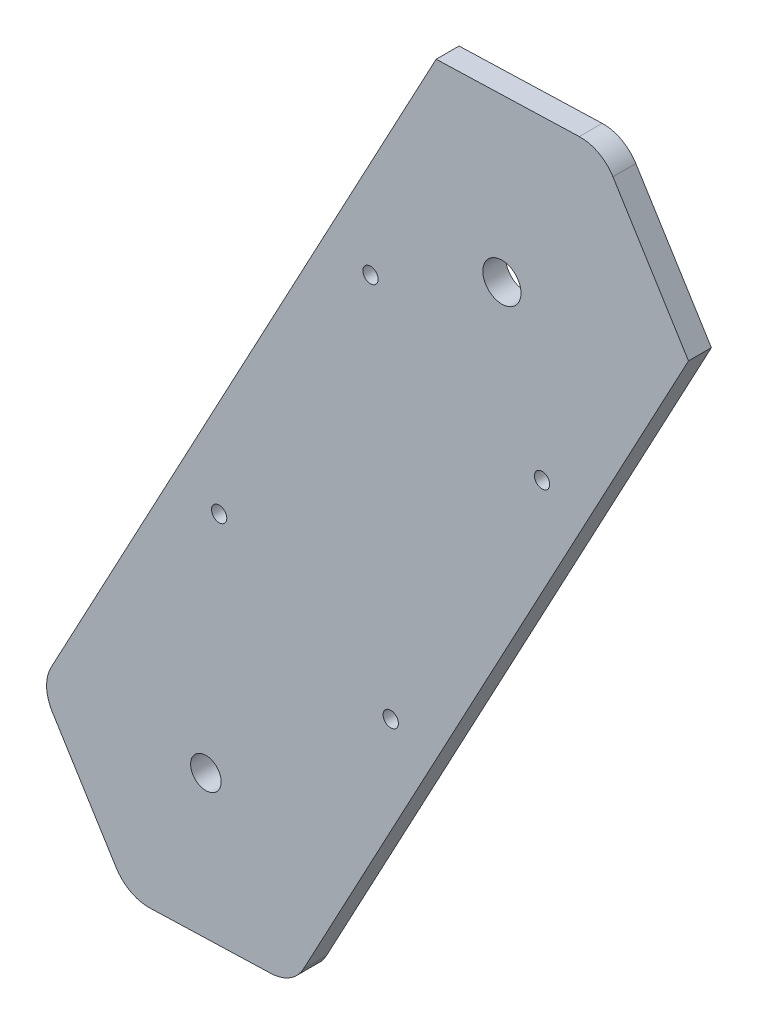
ISO-10303-21;
HEADER;
FILE_DESCRIPTION(('STEP AP214'),'2;1');
FILE_NAME('part.step','',(''),(''),'','','');
FILE_SCHEMA(('AUTOMOTIVE_DESIGN { 1 0 10303 214 1 1 1 1 }'));
ENDSEC;
DATA;
#1=APPLICATION_CONTEXT('core data for automotive mechanical design processes');
#2=APPLICATION_PROTOCOL_DEFINITION('international standard','automotive_design',2000,#1);
#3=PRODUCT_CONTEXT('',#1,'mechanical');
#4=PRODUCT('Part','Part','',(#3));
#5=PRODUCT_RELATED_PRODUCT_CATEGORY('part','',(#4));
#6=PRODUCT_DEFINITION_FORMATION('','',#4);
#7=PRODUCT_DEFINITION_CONTEXT('part definition',#1,'design');
#8=PRODUCT_DEFINITION('design','',#6,#7);
#9=PRODUCT_DEFINITION_SHAPE('','',#8);
#10=(LENGTH_UNIT() NAMED_UNIT(*) SI_UNIT(.MILLI.,.METRE.));
#11=(NAMED_UNIT(*) PLANE_ANGLE_UNIT() SI_UNIT($,.RADIAN.));
#12=(NAMED_UNIT(*) SI_UNIT($,.STERADIAN.) SOLID_ANGLE_UNIT());
#13=UNCERTAINTY_MEASURE_WITH_UNIT(LENGTH_MEASURE(1.E-05),#10,'distance_accuracy_value','');
#14=(GEOMETRIC_REPRESENTATION_CONTEXT(3) GLOBAL_UNCERTAINTY_ASSIGNED_CONTEXT((#13)) GLOBAL_UNIT_ASSIGNED_CONTEXT((#10,
#11,#12)) REPRESENTATION_CONTEXT('',''));
#15=CARTESIAN_POINT('',(0.,0.,0.));
#16=DIRECTION('',(0.,0.,1.));
#17=DIRECTION('',(1.,0.,0.));
#18=AXIS2_PLACEMENT_3D('',#15,#16,#17);
#19=CARTESIAN_POINT('',(-91.4536575262969,91.8515294636124,6.));
#20=DIRECTION('',(0.,0.,1.));
#21=DIRECTION('',(1.,0.,0.));
#22=AXIS2_PLACEMENT_3D('',#19,#20,#21);
#23=PLANE('',#22);
#24=CARTESIAN_POINT('',(-72.9831925429861,180.369292487786,6.));
#25=DIRECTION('',(0.,0.,1.));
#26=DIRECTION('',(1.,0.,0.));
#27=AXIS2_PLACEMENT_3D('',#24,#25,#26);
#28=CIRCLE('',#27,2.00000000014919);
#29=CARTESIAN_POINT('',(-70.9831925428369,180.369292487786,6.));
#30=VERTEX_POINT('',#29);
#31=EDGE_CURVE('E238',#30,#30,#28,.T.);
#32=ORIENTED_EDGE('',*,*,#31,.F.);
#33=EDGE_LOOP('',(#32));
#34=FACE_BOUND('',#33,.T.);
#35=CARTESIAN_POINT('',(-33.3325028900565,254.422130448577,6.));
#36=DIRECTION('',(0.,0.,1.));
#37=DIRECTION('',(1.,0.,0.));
#38=AXIS2_PLACEMENT_3D('',#35,#36,#37);
#39=CIRCLE('',#38,2.00000000023901);
#40=CARTESIAN_POINT('',(-31.3325028898175,254.422130448577,6.));
#41=VERTEX_POINT('',#40);
#42=EDGE_CURVE('E226',#41,#41,#39,.T.);
#43=ORIENTED_EDGE('',*,*,#42,.F.);
#44=EDGE_LOOP('',(#43));
#45=FACE_BOUND('',#44,.T.);
#46=CARTESIAN_POINT('',(11.6281487290785,230.348497445176,6.));
#47=DIRECTION('',(0.,0.,1.));
#48=DIRECTION('',(1.,0.,0.));
#49=AXIS2_PLACEMENT_3D('',#46,#47,#48);
#50=CIRCLE('',#49,2.0000000000549);
#51=CARTESIAN_POINT('',(13.6281487291335,230.348497445176,6.));
#52=VERTEX_POINT('',#51);
#53=EDGE_CURVE('E154',#52,#52,#50,.T.);
#54=ORIENTED_EDGE('',*,*,#53,.F.);
#55=EDGE_LOOP('',(#54));
#56=FACE_BOUND('',#55,.T.);
#57=CARTESIAN_POINT('',(-91.4536575262969,91.8515294636124,6.));
#58=DIRECTION('',(0.,0.,1.));
#59=DIRECTION('',(1.,0.,0.));
#60=AXIS2_PLACEMENT_3D('',#57,#58,#59);
#61=CIRCLE('',#60,9.99999999999952);
#62=CARTESIAN_POINT('',(-99.9494817520215,86.5769706455144,6.));
#63=VERTEX_POINT('',#62);
#64=CARTESIAN_POINT('',(-91.1336677089296,81.8566504489982,6.));
#65=VERTEX_POINT('',#64);
#66=EDGE_CURVE('E169',#63,#65,#61,.T.);
#67=ORIENTED_EDGE('',*,*,#66,.T.);
#68=DIRECTION('',(0.9994879014623,0.031998981710157,0.));
#69=VECTOR('',#68,1.);
#70=CARTESIAN_POINT('',(-91.1336677089296,81.8566504489982,6.));
#71=LINE('',#70,#69);
#72=CARTESIAN_POINT('',(-59.3956642160727,82.8727545877266,6.));
#73=VERTEX_POINT('',#72);
#74=EDGE_CURVE('E107',#65,#73,#71,.T.);
#75=ORIENTED_EDGE('',*,*,#74,.T.);
#76=CARTESIAN_POINT('',(-59.7156540331752,92.86763360235,6.));
#77=DIRECTION('',(0.,0.,1.));
#78=DIRECTION('',(1.,0.,0.));
#79=AXIS2_PLACEMENT_3D('',#76,#77,#78);
#80=CIRCLE('',#79,10.0000000000006);
#81=CARTESIAN_POINT('',(-50.8998399902097,88.1473134055981,6.));
#82=VERTEX_POINT('',#81);
#83=EDGE_CURVE('E190',#73,#82,#80,.T.);
#84=ORIENTED_EDGE('',*,*,#83,.T.);
#85=DIRECTION('',(0.472032019675121,0.881581404296521,0.));
#86=VECTOR('',#85,1.);
#87=CARTESIAN_POINT('',(-50.8998399902096,88.147313405598,6.));
#88=LINE('',#87,#86);
#89=CARTESIAN_POINT('',(49.994476851633,276.580618392382,6.));
#90=VERTEX_POINT('',#89);
#91=EDGE_CURVE('E209',#82,#90,#88,.T.);
#92=ORIENTED_EDGE('',*,*,#91,.T.);
#93=DIRECTION('',(-0.52745588178721,0.849582422586577,0.));
#94=VECTOR('',#93,1.);
#95=CARTESIAN_POINT('',(49.994476851633,276.580618392382,6.));
#96=LINE('',#95,#94);
#97=CARTESIAN_POINT('',(30.200235154826,308.463550017025,6.));
#98=VERTEX_POINT('',#97);
#99=EDGE_CURVE('E206',#90,#98,#96,.T.);
#100=ORIENTED_EDGE('',*,*,#99,.T.);
#101=CARTESIAN_POINT('',(21.7044109289608,303.188991199154,6.));
#102=DIRECTION('',(0.,0.,1.));
#103=DIRECTION('',(1.,0.,0.));
#104=AXIS2_PLACEMENT_3D('',#101,#102,#103);
#105=CIRCLE('',#104,9.99999999999937);
#106=CARTESIAN_POINT('',(21.3844211118558,313.183870213776,6.));
#107=VERTEX_POINT('',#106);
#108=EDGE_CURVE('E208',#98,#107,#105,.T.);
#109=ORIENTED_EDGE('',*,*,#108,.T.);
#110=DIRECTION('',(-0.999487901462289,-0.0319989817105021,0.));
#111=VECTOR('',#110,1.);
#112=CARTESIAN_POINT('',(21.3844211118558,313.183870213776,6.));
#113=LINE('',#112,#111);
#114=CARTESIAN_POINT('',(-16.1241284706103,311.983019867993,6.));
#115=VERTEX_POINT('',#114);
#116=EDGE_CURVE('E132',#107,#115,#113,.T.);
#117=ORIENTED_EDGE('',*,*,#116,.T.);
#118=DIRECTION('',(-0.472032019674563,-0.88158140429682,0.));
#119=VECTOR('',#118,1.);
#120=CARTESIAN_POINT('',(-16.1241284706103,311.983019867993,6.));
#121=LINE('',#120,#119);
#122=CARTESIAN_POINT('',(-117.018445312334,123.549714881145,6.));
#123=VERTEX_POINT('',#122);
#124=EDGE_CURVE('E126',#115,#123,#121,.T.);
#125=ORIENTED_EDGE('',*,*,#124,.T.);
#126=CARTESIAN_POINT('',(-108.202631269366,118.8293946844,6.));
#127=DIRECTION('',(0.,0.,1.));
#128=DIRECTION('',(1.,0.,0.));
#129=AXIS2_PLACEMENT_3D('',#126,#127,#128);
#130=CIRCLE('',#129,9.99999999999937);
#131=CARTESIAN_POINT('',(-116.698455495227,113.55483586652,6.));
#132=VERTEX_POINT('',#131);
#133=EDGE_CURVE('E130',#123,#132,#130,.T.);
#134=ORIENTED_EDGE('',*,*,#133,.T.);
#135=DIRECTION('',(0.527455881779421,-0.849582422591412,0.));
#136=VECTOR('',#135,1.);
#137=CARTESIAN_POINT('',(-116.698455495227,113.55483586652,6.));
#138=LINE('',#137,#136);
#139=EDGE_CURVE('E58',#132,#63,#138,.T.);
#140=ORIENTED_EDGE('',*,*,#139,.T.);
#141=EDGE_LOOP('',(#67,#75,#84,#92,#100,#109,#117,#125,#134,#140));
#142=FACE_BOUND('',#141,.T.);
#143=CARTESIAN_POINT('',(1.10482999925274,270.012836124976,6.));
#144=DIRECTION('',(0.,0.,1.));
#145=DIRECTION('',(1.,0.,0.));
#146=AXIS2_PLACEMENT_3D('',#143,#144,#145);
#147=CIRCLE('',#146,5.00000000002419);
#148=CARTESIAN_POINT('',(6.10482999927693,270.012836124976,6.));
#149=VERTEX_POINT('',#148);
#150=EDGE_CURVE('E220',#149,#149,#147,.T.);
#151=ORIENTED_EDGE('',*,*,#150,.F.);
#152=EDGE_LOOP('',(#151));
#153=FACE_BOUND('',#152,.T.);
#154=CARTESIAN_POINT('',(-28.0225409238483,156.295659484385,6.));
#155=DIRECTION('',(0.,0.,1.));
#156=DIRECTION('',(1.,0.,0.));
#157=AXIS2_PLACEMENT_3D('',#154,#155,#156);
#158=CIRCLE('',#157,1.99999999996505);
#159=CARTESIAN_POINT('',(-26.0225409238832,156.295659484385,6.));
#160=VERTEX_POINT('',#159);
#161=EDGE_CURVE('E232',#160,#160,#158,.T.);
#162=ORIENTED_EDGE('',*,*,#161,.F.);
#163=EDGE_LOOP('',(#162));
#164=FACE_BOUND('',#163,.T.);
#165=CARTESIAN_POINT('',(-76.4646277765106,119.84549882328,6.));
#166=DIRECTION('',(0.,0.,1.));
#167=DIRECTION('',(1.,0.,0.));
#168=AXIS2_PLACEMENT_3D('',#165,#166,#167);
#169=CIRCLE('',#168,4.00000000000299);
#170=CARTESIAN_POINT('',(-72.4646277765076,119.84549882328,6.));
#171=VERTEX_POINT('',#170);
#172=EDGE_CURVE('E244',#171,#171,#169,.T.);
#173=ORIENTED_EDGE('',*,*,#172,.F.);
#174=EDGE_LOOP('',(#173));
#175=FACE_BOUND('',#174,.T.);
#176=ADVANCED_FACE('F41',(#34,#45,#56,#142,#153,#164,#175),#23,.T.);
#177=CARTESIAN_POINT('',(-91.4536575262969,91.8515294636124,0.));
#178=DIRECTION('',(0.,0.,1.));
#179=DIRECTION('',(1.,0.,0.));
#180=AXIS2_PLACEMENT_3D('',#177,#178,#179);
#181=PLANE('',#180);
#182=CARTESIAN_POINT('',(-91.4536575262969,91.8515294636124,0.));
#183=DIRECTION('',(0.,0.,1.));
#184=DIRECTION('',(1.,0.,0.));
#185=AXIS2_PLACEMENT_3D('',#182,#183,#184);
#186=CIRCLE('',#185,9.99999999999952);
#187=CARTESIAN_POINT('',(-99.9494817520215,86.5769706455144,0.));
#188=VERTEX_POINT('',#187);
#189=CARTESIAN_POINT('',(-91.1336677089296,81.8566504489982,0.));
#190=VERTEX_POINT('',#189);
#191=EDGE_CURVE('E150',#188,#190,#186,.T.);
#192=ORIENTED_EDGE('',*,*,#191,.F.);
#193=DIRECTION('',(0.527455881779421,-0.849582422591412,0.));
#194=VECTOR('',#193,1.);
#195=CARTESIAN_POINT('',(-116.698455495227,113.55483586652,0.));
#196=LINE('',#195,#194);
#197=CARTESIAN_POINT('',(-116.698455495227,113.55483586652,0.));
#198=VERTEX_POINT('',#197);
#199=EDGE_CURVE('E99',#198,#188,#196,.T.);
#200=ORIENTED_EDGE('',*,*,#199,.F.);
#201=CARTESIAN_POINT('',(-108.202631269366,118.8293946844,0.));
#202=DIRECTION('',(0.,0.,1.));
#203=DIRECTION('',(1.,0.,0.));
#204=AXIS2_PLACEMENT_3D('',#201,#202,#203);
#205=CIRCLE('',#204,9.99999999999937);
#206=CARTESIAN_POINT('',(-117.018445312334,123.549714881145,0.));
#207=VERTEX_POINT('',#206);
#208=EDGE_CURVE('E93',#207,#198,#205,.T.);
#209=ORIENTED_EDGE('',*,*,#208,.F.);
#210=DIRECTION('',(-0.472032019674563,-0.88158140429682,0.));
#211=VECTOR('',#210,1.);
#212=CARTESIAN_POINT('',(-16.1241284706103,311.983019867993,0.));
#213=LINE('',#212,#211);
#214=CARTESIAN_POINT('',(-16.1241284706103,311.983019867993,0.));
#215=VERTEX_POINT('',#214);
#216=EDGE_CURVE('E140',#215,#207,#213,.T.);
#217=ORIENTED_EDGE('',*,*,#216,.F.);
#218=DIRECTION('',(-0.999487901462289,-0.0319989817105021,0.));
#219=VECTOR('',#218,1.);
#220=CARTESIAN_POINT('',(21.3844211118558,313.183870213776,0.));
#221=LINE('',#220,#219);
#222=CARTESIAN_POINT('',(21.3844211118558,313.183870213776,0.));
#223=VERTEX_POINT('',#222);
#224=EDGE_CURVE('E164',#223,#215,#221,.T.);
#225=ORIENTED_EDGE('',*,*,#224,.F.);
#226=CARTESIAN_POINT('',(21.7044109289608,303.188991199154,0.));
#227=DIRECTION('',(0.,0.,1.));
#228=DIRECTION('',(1.,0.,0.));
#229=AXIS2_PLACEMENT_3D('',#226,#227,#228);
#230=CIRCLE('',#229,9.99999999999937);
#231=CARTESIAN_POINT('',(30.200235154826,308.463550017025,0.));
#232=VERTEX_POINT('',#231);
#233=EDGE_CURVE('E162',#232,#223,#230,.T.);
#234=ORIENTED_EDGE('',*,*,#233,.F.);
#235=DIRECTION('',(-0.52745588178721,0.849582422586577,0.));
#236=VECTOR('',#235,1.);
#237=CARTESIAN_POINT('',(49.994476851633,276.580618392382,0.));
#238=LINE('',#237,#236);
#239=CARTESIAN_POINT('',(49.994476851633,276.580618392382,0.));
#240=VERTEX_POINT('',#239);
#241=EDGE_CURVE('E160',#240,#232,#238,.T.);
#242=ORIENTED_EDGE('',*,*,#241,.F.);
#243=DIRECTION('',(0.472032019675121,0.881581404296521,0.));
#244=VECTOR('',#243,1.);
#245=CARTESIAN_POINT('',(-50.8998399902096,88.147313405598,0.));
#246=LINE('',#245,#244);
#247=CARTESIAN_POINT('',(-50.8998399902097,88.1473134055981,0.));
#248=VERTEX_POINT('',#247);
#249=EDGE_CURVE('E158',#248,#240,#246,.T.);
#250=ORIENTED_EDGE('',*,*,#249,.F.);
#251=CARTESIAN_POINT('',(-59.7156540331752,92.86763360235,0.));
#252=DIRECTION('',(0.,0.,1.));
#253=DIRECTION('',(1.,0.,0.));
#254=AXIS2_PLACEMENT_3D('',#251,#252,#253);
#255=CIRCLE('',#254,10.0000000000006);
#256=CARTESIAN_POINT('',(-59.3956642160727,82.8727545877266,0.));
#257=VERTEX_POINT('',#256);
#258=EDGE_CURVE('E156',#257,#248,#255,.T.);
#259=ORIENTED_EDGE('',*,*,#258,.F.);
#260=DIRECTION('',(0.9994879014623,0.031998981710157,0.));
#261=VECTOR('',#260,1.);
#262=CARTESIAN_POINT('',(-91.1336677089296,81.8566504489982,0.));
#263=LINE('',#262,#261);
#264=EDGE_CURVE('E153',#190,#257,#263,.T.);
#265=ORIENTED_EDGE('',*,*,#264,.F.);
#266=EDGE_LOOP('',(#192,#200,#209,#217,#225,#234,#242,#250,#259,#265));
#267=FACE_BOUND('',#266,.T.);
#268=CARTESIAN_POINT('',(11.6281487290785,230.348497445176,0.));
#269=DIRECTION('',(0.,0.,1.));
#270=DIRECTION('',(1.,0.,0.));
#271=AXIS2_PLACEMENT_3D('',#268,#269,#270);
#272=CIRCLE('',#271,2.0000000000549);
#273=CARTESIAN_POINT('',(13.6281487291335,230.348497445176,0.));
#274=VERTEX_POINT('',#273);
#275=EDGE_CURVE('E217',#274,#274,#272,.T.);
#276=ORIENTED_EDGE('',*,*,#275,.T.);
#277=EDGE_LOOP('',(#276));
#278=FACE_BOUND('',#277,.T.);
#279=CARTESIAN_POINT('',(1.10482999925274,270.012836124976,0.));
#280=DIRECTION('',(0.,0.,1.));
#281=DIRECTION('',(1.,0.,0.));
#282=AXIS2_PLACEMENT_3D('',#279,#280,#281);
#283=CIRCLE('',#282,5.00000000002419);
#284=CARTESIAN_POINT('',(6.10482999927693,270.012836124976,0.));
#285=VERTEX_POINT('',#284);
#286=EDGE_CURVE('E223',#285,#285,#283,.T.);
#287=ORIENTED_EDGE('',*,*,#286,.T.);
#288=EDGE_LOOP('',(#287));
#289=FACE_BOUND('',#288,.T.);
#290=CARTESIAN_POINT('',(-33.3325028900565,254.422130448577,0.));
#291=DIRECTION('',(0.,0.,1.));
#292=DIRECTION('',(1.,0.,0.));
#293=AXIS2_PLACEMENT_3D('',#290,#291,#292);
#294=CIRCLE('',#293,2.00000000023901);
#295=CARTESIAN_POINT('',(-31.3325028898175,254.422130448577,0.));
#296=VERTEX_POINT('',#295);
#297=EDGE_CURVE('E229',#296,#296,#294,.T.);
#298=ORIENTED_EDGE('',*,*,#297,.T.);
#299=EDGE_LOOP('',(#298));
#300=FACE_BOUND('',#299,.T.);
#301=CARTESIAN_POINT('',(-28.0225409238483,156.295659484385,0.));
#302=DIRECTION('',(0.,0.,1.));
#303=DIRECTION('',(1.,0.,0.));
#304=AXIS2_PLACEMENT_3D('',#301,#302,#303);
#305=CIRCLE('',#304,1.99999999996505);
#306=CARTESIAN_POINT('',(-26.0225409238832,156.295659484385,0.));
#307=VERTEX_POINT('',#306);
#308=EDGE_CURVE('E235',#307,#307,#305,.T.);
#309=ORIENTED_EDGE('',*,*,#308,.T.);
#310=EDGE_LOOP('',(#309));
#311=FACE_BOUND('',#310,.T.);
#312=CARTESIAN_POINT('',(-72.9831925429861,180.369292487786,0.));
#313=DIRECTION('',(0.,0.,1.));
#314=DIRECTION('',(1.,0.,0.));
#315=AXIS2_PLACEMENT_3D('',#312,#313,#314);
#316=CIRCLE('',#315,2.00000000014919);
#317=CARTESIAN_POINT('',(-70.9831925428369,180.369292487786,0.));
#318=VERTEX_POINT('',#317);
#319=EDGE_CURVE('E241',#318,#318,#316,.T.);
#320=ORIENTED_EDGE('',*,*,#319,.T.);
#321=EDGE_LOOP('',(#320));
#322=FACE_BOUND('',#321,.T.);
#323=CARTESIAN_POINT('',(-76.4646277765106,119.84549882328,0.));
#324=DIRECTION('',(0.,0.,1.));
#325=DIRECTION('',(1.,0.,0.));
#326=AXIS2_PLACEMENT_3D('',#323,#324,#325);
#327=CIRCLE('',#326,4.00000000000299);
#328=CARTESIAN_POINT('',(-72.4646277765076,119.84549882328,0.));
#329=VERTEX_POINT('',#328);
#330=EDGE_CURVE('E247',#329,#329,#327,.T.);
#331=ORIENTED_EDGE('',*,*,#330,.T.);
#332=EDGE_LOOP('',(#331));
#333=FACE_BOUND('',#332,.T.);
#334=ADVANCED_FACE('F194',(#267,#278,#289,#300,#311,#322,#333),#181,.F.);
#335=CARTESIAN_POINT('',(-91.4536575262969,91.8515294636124,6.));
#336=DIRECTION('',(0.,0.,-1.));
#337=DIRECTION('',(-1.,0.,0.));
#338=AXIS2_PLACEMENT_3D('',#335,#336,#337);
#339=CYLINDRICAL_SURFACE('',#338,9.99999999999952);
#340=ORIENTED_EDGE('',*,*,#191,.T.);
#341=DIRECTION('',(0.,0.,-1.));
#342=VECTOR('',#341,1.);
#343=CARTESIAN_POINT('',(-91.1336677089296,81.8566504489982,6.));
#344=LINE('',#343,#342);
#345=EDGE_CURVE('E11',#65,#190,#344,.T.);
#346=ORIENTED_EDGE('',*,*,#345,.F.);
#347=ORIENTED_EDGE('',*,*,#66,.F.);
#348=DIRECTION('',(0.,0.,-1.));
#349=VECTOR('',#348,1.);
#350=CARTESIAN_POINT('',(-99.9494817520215,86.5769706455144,6.));
#351=LINE('',#350,#349);
#352=EDGE_CURVE('E146',#63,#188,#351,.T.);
#353=ORIENTED_EDGE('',*,*,#352,.T.);
#354=EDGE_LOOP('',(#340,#346,#347,#353));
#355=FACE_BOUND('',#354,.T.);
#356=ADVANCED_FACE('F43',(#355),#339,.T.);
#357=CARTESIAN_POINT('',(-91.1336677089296,81.8566504489982,6.));
#358=DIRECTION('',(-0.031998981710157,0.9994879014623,0.));
#359=DIRECTION('',(-0.9994879014623,-0.0319989817101571,0.));
#360=AXIS2_PLACEMENT_3D('',#357,#358,#359);
#361=PLANE('',#360);
#362=ORIENTED_EDGE('',*,*,#264,.T.);
#363=DIRECTION('',(0.,0.,-1.));
#364=VECTOR('',#363,1.);
#365=CARTESIAN_POINT('',(-59.3956642160727,82.8727545877266,6.));
#366=LINE('',#365,#364);
#367=EDGE_CURVE('E50',#73,#257,#366,.T.);
#368=ORIENTED_EDGE('',*,*,#367,.F.);
#369=ORIENTED_EDGE('',*,*,#74,.F.);
#370=ORIENTED_EDGE('',*,*,#345,.T.);
#371=EDGE_LOOP('',(#362,#368,#369,#370));
#372=FACE_BOUND('',#371,.T.);
#373=ADVANCED_FACE('F289',(#372),#361,.F.);
#374=CARTESIAN_POINT('',(-59.7156540331752,92.86763360235,6.));
#375=DIRECTION('',(0.,0.,-1.));
#376=DIRECTION('',(-1.,0.,0.));
#377=AXIS2_PLACEMENT_3D('',#374,#375,#376);
#378=CYLINDRICAL_SURFACE('',#377,10.0000000000006);
#379=ORIENTED_EDGE('',*,*,#258,.T.);
#380=DIRECTION('',(0.,0.,-1.));
#381=VECTOR('',#380,1.);
#382=CARTESIAN_POINT('',(-50.8998399902097,88.1473134055981,6.));
#383=LINE('',#382,#381);
#384=EDGE_CURVE('E182',#82,#248,#383,.T.);
#385=ORIENTED_EDGE('',*,*,#384,.F.);
#386=ORIENTED_EDGE('',*,*,#83,.F.);
#387=ORIENTED_EDGE('',*,*,#367,.T.);
#388=EDGE_LOOP('',(#379,#385,#386,#387));
#389=FACE_BOUND('',#388,.T.);
#390=ADVANCED_FACE('F188',(#389),#378,.T.);
#391=CARTESIAN_POINT('',(-50.8998399902096,88.147313405598,6.));
#392=DIRECTION('',(-0.881581404296521,0.472032019675121,0.));
#393=DIRECTION('',(-0.472032019675121,-0.881581404296521,0.));
#394=AXIS2_PLACEMENT_3D('',#391,#392,#393);
#395=PLANE('',#394);
#396=ORIENTED_EDGE('',*,*,#249,.T.);
#397=DIRECTION('',(0.,0.,-1.));
#398=VECTOR('',#397,1.);
#399=CARTESIAN_POINT('',(49.994476851633,276.580618392382,6.));
#400=LINE('',#399,#398);
#401=EDGE_CURVE('E179',#90,#240,#400,.T.);
#402=ORIENTED_EDGE('',*,*,#401,.F.);
#403=ORIENTED_EDGE('',*,*,#91,.F.);
#404=ORIENTED_EDGE('',*,*,#384,.T.);
#405=EDGE_LOOP('',(#396,#402,#403,#404));
#406=FACE_BOUND('',#405,.T.);
#407=ADVANCED_FACE('F200',(#406),#395,.F.);
#408=CARTESIAN_POINT('',(49.994476851633,276.580618392382,6.));
#409=DIRECTION('',(-0.849582422586577,-0.52745588178721,0.));
#410=DIRECTION('',(0.52745588178721,-0.849582422586577,0.));
#411=AXIS2_PLACEMENT_3D('',#408,#409,#410);
#412=PLANE('',#411);
#413=ORIENTED_EDGE('',*,*,#241,.T.);
#414=DIRECTION('',(0.,0.,-1.));
#415=VECTOR('',#414,1.);
#416=CARTESIAN_POINT('',(30.200235154826,308.463550017025,6.));
#417=LINE('',#416,#415);
#418=EDGE_CURVE('E176',#98,#232,#417,.T.);
#419=ORIENTED_EDGE('',*,*,#418,.F.);
#420=ORIENTED_EDGE('',*,*,#99,.F.);
#421=ORIENTED_EDGE('',*,*,#401,.T.);
#422=EDGE_LOOP('',(#413,#419,#420,#421));
#423=FACE_BOUND('',#422,.T.);
#424=ADVANCED_FACE('F204',(#423),#412,.F.);
#425=CARTESIAN_POINT('',(21.7044109289608,303.188991199154,6.));
#426=DIRECTION('',(0.,0.,-1.));
#427=DIRECTION('',(-1.,0.,0.));
#428=AXIS2_PLACEMENT_3D('',#425,#426,#427);
#429=CYLINDRICAL_SURFACE('',#428,9.99999999999937);
#430=ORIENTED_EDGE('',*,*,#233,.T.);
#431=DIRECTION('',(0.,0.,-1.));
#432=VECTOR('',#431,1.);
#433=CARTESIAN_POINT('',(21.3844211118558,313.183870213776,6.));
#434=LINE('',#433,#432);
#435=EDGE_CURVE('E173',#107,#223,#434,.T.);
#436=ORIENTED_EDGE('',*,*,#435,.F.);
#437=ORIENTED_EDGE('',*,*,#108,.F.);
#438=ORIENTED_EDGE('',*,*,#418,.T.);
#439=EDGE_LOOP('',(#430,#436,#437,#438));
#440=FACE_BOUND('',#439,.T.);
#441=ADVANCED_FACE('F279',(#440),#429,.T.);
#442=CARTESIAN_POINT('',(21.3844211118558,313.183870213776,6.));
#443=DIRECTION('',(0.0319989817105021,-0.999487901462289,0.));
#444=DIRECTION('',(0.999487901462289,0.0319989817105021,0.));
#445=AXIS2_PLACEMENT_3D('',#442,#443,#444);
#446=PLANE('',#445);
#447=ORIENTED_EDGE('',*,*,#224,.T.);
#448=DIRECTION('',(0.,0.,-1.));
#449=VECTOR('',#448,1.);
#450=CARTESIAN_POINT('',(-16.1241284706103,311.983019867993,6.));
#451=LINE('',#450,#449);
#452=EDGE_CURVE('E141',#115,#215,#451,.T.);
#453=ORIENTED_EDGE('',*,*,#452,.F.);
#454=ORIENTED_EDGE('',*,*,#116,.F.);
#455=ORIENTED_EDGE('',*,*,#435,.T.);
#456=EDGE_LOOP('',(#447,#453,#454,#455));
#457=FACE_BOUND('',#456,.T.);
#458=ADVANCED_FACE('F276',(#457),#446,.F.);
#459=CARTESIAN_POINT('',(-16.1241284706103,311.983019867993,6.));
#460=DIRECTION('',(0.88158140429682,-0.472032019674563,0.));
#461=DIRECTION('',(0.472032019674563,0.88158140429682,0.));
#462=AXIS2_PLACEMENT_3D('',#459,#460,#461);
#463=PLANE('',#462);
#464=ORIENTED_EDGE('',*,*,#216,.T.);
#465=DIRECTION('',(0.,0.,-1.));
#466=VECTOR('',#465,1.);
#467=CARTESIAN_POINT('',(-117.018445312334,123.549714881145,6.));
#468=LINE('',#467,#466);
#469=EDGE_CURVE('E137',#123,#207,#468,.T.);
#470=ORIENTED_EDGE('',*,*,#469,.F.);
#471=ORIENTED_EDGE('',*,*,#124,.F.);
#472=ORIENTED_EDGE('',*,*,#452,.T.);
#473=EDGE_LOOP('',(#464,#470,#471,#472));
#474=FACE_BOUND('',#473,.T.);
#475=ADVANCED_FACE('F138',(#474),#463,.F.);
#476=CARTESIAN_POINT('',(-108.202631269366,118.8293946844,6.));
#477=DIRECTION('',(0.,0.,-1.));
#478=DIRECTION('',(-1.,0.,0.));
#479=AXIS2_PLACEMENT_3D('',#476,#477,#478);
#480=CYLINDRICAL_SURFACE('',#479,9.99999999999937);
#481=ORIENTED_EDGE('',*,*,#208,.T.);
#482=DIRECTION('',(0.,0.,-1.));
#483=VECTOR('',#482,1.);
#484=CARTESIAN_POINT('',(-116.698455495227,113.55483586652,6.));
#485=LINE('',#484,#483);
#486=EDGE_CURVE('E142',#132,#198,#485,.T.);
#487=ORIENTED_EDGE('',*,*,#486,.F.);
#488=ORIENTED_EDGE('',*,*,#133,.F.);
#489=ORIENTED_EDGE('',*,*,#469,.T.);
#490=EDGE_LOOP('',(#481,#487,#488,#489));
#491=FACE_BOUND('',#490,.T.);
#492=ADVANCED_FACE('F144',(#491),#480,.T.);
#493=CARTESIAN_POINT('',(-116.698455495227,113.55483586652,6.));
#494=DIRECTION('',(0.849582422591413,0.527455881779421,0.));
#495=DIRECTION('',(-0.527455881779421,0.849582422591413,0.));
#496=AXIS2_PLACEMENT_3D('',#493,#494,#495);
#497=PLANE('',#496);
#498=ORIENTED_EDGE('',*,*,#199,.T.);
#499=ORIENTED_EDGE('',*,*,#352,.F.);
#500=ORIENTED_EDGE('',*,*,#139,.F.);
#501=ORIENTED_EDGE('',*,*,#486,.T.);
#502=EDGE_LOOP('',(#498,#499,#500,#501));
#503=FACE_BOUND('',#502,.T.);
#504=ADVANCED_FACE('F269',(#503),#497,.F.);
#505=CARTESIAN_POINT('',(11.6281487290785,230.348497445176,6.));
#506=DIRECTION('',(0.,0.,-1.));
#507=DIRECTION('',(-1.,0.,0.));
#508=AXIS2_PLACEMENT_3D('',#505,#506,#507);
#509=CYLINDRICAL_SURFACE('',#508,2.0000000000549);
#510=ORIENTED_EDGE('',*,*,#53,.T.);
#511=EDGE_LOOP('',(#510));
#512=FACE_BOUND('',#511,.T.);
#513=ORIENTED_EDGE('',*,*,#275,.F.);
#514=EDGE_LOOP('',(#513));
#515=FACE_BOUND('',#514,.T.);
#516=ADVANCED_FACE('F266',(#512,#515),#509,.F.);
#517=CARTESIAN_POINT('',(1.10482999925274,270.012836124976,6.));
#518=DIRECTION('',(0.,0.,-1.));
#519=DIRECTION('',(-1.,0.,0.));
#520=AXIS2_PLACEMENT_3D('',#517,#518,#519);
#521=CYLINDRICAL_SURFACE('',#520,5.00000000002419);
#522=ORIENTED_EDGE('',*,*,#150,.T.);
#523=EDGE_LOOP('',(#522));
#524=FACE_BOUND('',#523,.T.);
#525=ORIENTED_EDGE('',*,*,#286,.F.);
#526=EDGE_LOOP('',(#525));
#527=FACE_BOUND('',#526,.T.);
#528=ADVANCED_FACE('F379',(#524,#527),#521,.F.);
#529=CARTESIAN_POINT('',(-33.3325028900565,254.422130448577,6.));
#530=DIRECTION('',(0.,0.,-1.));
#531=DIRECTION('',(-1.,0.,0.));
#532=AXIS2_PLACEMENT_3D('',#529,#530,#531);
#533=CYLINDRICAL_SURFACE('',#532,2.00000000023901);
#534=ORIENTED_EDGE('',*,*,#42,.T.);
#535=EDGE_LOOP('',(#534));
#536=FACE_BOUND('',#535,.T.);
#537=ORIENTED_EDGE('',*,*,#297,.F.);
#538=EDGE_LOOP('',(#537));
#539=FACE_BOUND('',#538,.T.);
#540=ADVANCED_FACE('F388',(#536,#539),#533,.F.);
#541=CARTESIAN_POINT('',(-28.0225409238483,156.295659484385,6.));
#542=DIRECTION('',(0.,0.,-1.));
#543=DIRECTION('',(-1.,0.,0.));
#544=AXIS2_PLACEMENT_3D('',#541,#542,#543);
#545=CYLINDRICAL_SURFACE('',#544,1.99999999996505);
#546=ORIENTED_EDGE('',*,*,#161,.T.);
#547=EDGE_LOOP('',(#546));
#548=FACE_BOUND('',#547,.T.);
#549=ORIENTED_EDGE('',*,*,#308,.F.);
#550=EDGE_LOOP('',(#549));
#551=FACE_BOUND('',#550,.T.);
#552=ADVANCED_FACE('F397',(#548,#551),#545,.F.);
#553=CARTESIAN_POINT('',(-72.9831925429861,180.369292487786,6.));
#554=DIRECTION('',(0.,0.,-1.));
#555=DIRECTION('',(-1.,0.,0.));
#556=AXIS2_PLACEMENT_3D('',#553,#554,#555);
#557=CYLINDRICAL_SURFACE('',#556,2.00000000014919);
#558=ORIENTED_EDGE('',*,*,#31,.T.);
#559=EDGE_LOOP('',(#558));
#560=FACE_BOUND('',#559,.T.);
#561=ORIENTED_EDGE('',*,*,#319,.F.);
#562=EDGE_LOOP('',(#561));
#563=FACE_BOUND('',#562,.T.);
#564=ADVANCED_FACE('F407',(#560,#563),#557,.F.);
#565=CARTESIAN_POINT('',(-76.4646277765106,119.84549882328,6.));
#566=DIRECTION('',(0.,0.,-1.));
#567=DIRECTION('',(-1.,0.,0.));
#568=AXIS2_PLACEMENT_3D('',#565,#566,#567);
#569=CYLINDRICAL_SURFACE('',#568,4.00000000000299);
#570=ORIENTED_EDGE('',*,*,#172,.T.);
#571=EDGE_LOOP('',(#570));
#572=FACE_BOUND('',#571,.T.);
#573=ORIENTED_EDGE('',*,*,#330,.F.);
#574=EDGE_LOOP('',(#573));
#575=FACE_BOUND('',#574,.T.);
#576=ADVANCED_FACE('F253',(#572,#575),#569,.F.);
#577=CLOSED_SHELL('',(#176,#334,#356,#373,#390,#407,#424,#441,#458,#475,#492,#504,#516,#528,
#540,#552,#564,#576));
#578=MANIFOLD_SOLID_BREP('B2',#577);
#579=ADVANCED_BREP_SHAPE_REPRESENTATION('',(#18,#578),#14);
#580=SHAPE_DEFINITION_REPRESENTATION(#9,#579);
ENDSEC;
END-ISO-10303-21;
